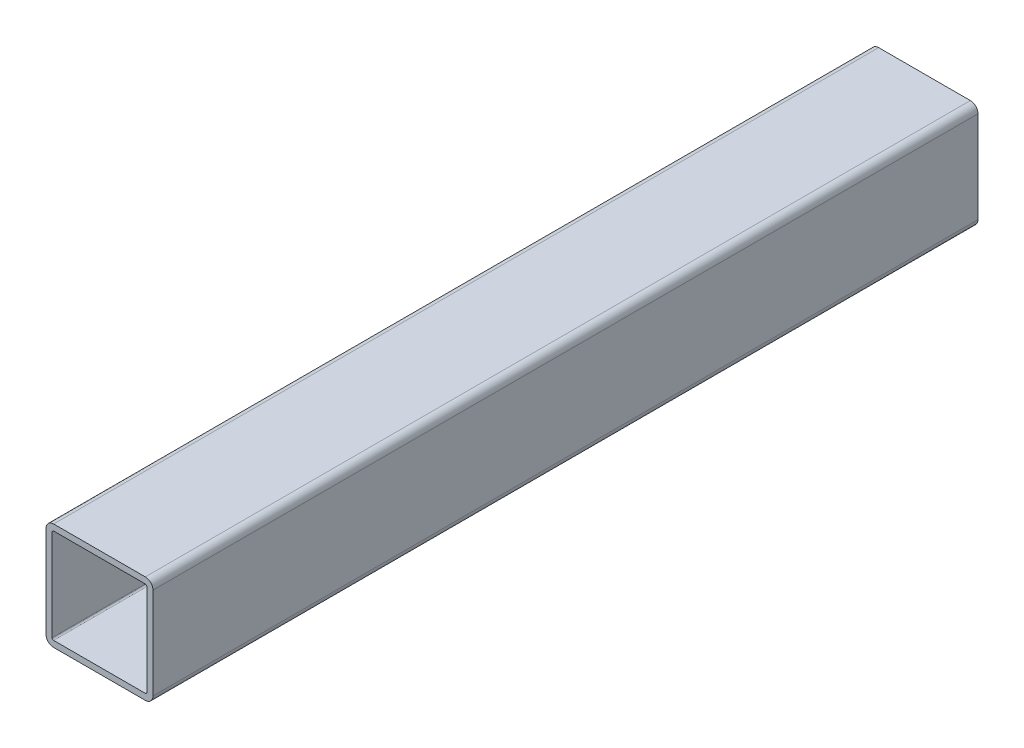
ISO-10303-21;
HEADER;
FILE_DESCRIPTION(('STEP AP214'),'2;1');
FILE_NAME('part.step','',(''),(''),'','','');
FILE_SCHEMA(('AUTOMOTIVE_DESIGN { 1 0 10303 214 1 1 1 1 }'));
ENDSEC;
DATA;
#1=APPLICATION_CONTEXT('core data for automotive mechanical design processes');
#2=APPLICATION_PROTOCOL_DEFINITION('international standard','automotive_design',2000,#1);
#3=PRODUCT_CONTEXT('',#1,'mechanical');
#4=PRODUCT('Part','Part','',(#3));
#5=PRODUCT_RELATED_PRODUCT_CATEGORY('part','',(#4));
#6=PRODUCT_DEFINITION_FORMATION('','',#4);
#7=PRODUCT_DEFINITION_CONTEXT('part definition',#1,'design');
#8=PRODUCT_DEFINITION('design','',#6,#7);
#9=PRODUCT_DEFINITION_SHAPE('','',#8);
#10=(LENGTH_UNIT() NAMED_UNIT(*) SI_UNIT(.MILLI.,.METRE.));
#11=(NAMED_UNIT(*) PLANE_ANGLE_UNIT() SI_UNIT($,.RADIAN.));
#12=(NAMED_UNIT(*) SI_UNIT($,.STERADIAN.) SOLID_ANGLE_UNIT());
#13=UNCERTAINTY_MEASURE_WITH_UNIT(LENGTH_MEASURE(1.E-05),#10,'distance_accuracy_value','');
#14=(GEOMETRIC_REPRESENTATION_CONTEXT(3) GLOBAL_UNCERTAINTY_ASSIGNED_CONTEXT((#13)) GLOBAL_UNIT_ASSIGNED_CONTEXT((#10,
#11,#12)) REPRESENTATION_CONTEXT('',''));
#15=CARTESIAN_POINT('',(0.,0.,0.));
#16=DIRECTION('',(0.,0.,1.));
#17=DIRECTION('',(1.,0.,0.));
#18=AXIS2_PLACEMENT_3D('',#15,#16,#17);
#19=CARTESIAN_POINT('',(5.,5.,540.));
#20=DIRECTION('',(0.,0.,-1.));
#21=DIRECTION('',(-1.,0.,0.));
#22=AXIS2_PLACEMENT_3D('',#19,#20,#21);
#23=PLANE('',#22);
#24=CARTESIAN_POINT('',(5.,5.,540.));
#25=DIRECTION('',(0.,0.,1.));
#26=DIRECTION('',(-1.,0.,0.));
#27=AXIS2_PLACEMENT_3D('',#24,#25,#26);
#28=CIRCLE('',#27,5.);
#29=CARTESIAN_POINT('',(0.,5.00000000000004,540.));
#30=VERTEX_POINT('',#29);
#31=CARTESIAN_POINT('',(5.00000000000004,0.,540.));
#32=VERTEX_POINT('',#31);
#33=EDGE_CURVE('E211',#30,#32,#28,.T.);
#34=ORIENTED_EDGE('',*,*,#33,.T.);
#35=DIRECTION('',(1.,0.,0.));
#36=VECTOR('',#35,1.);
#37=CARTESIAN_POINT('',(5.00000000000004,0.,540.));
#38=LINE('',#37,#36);
#39=CARTESIAN_POINT('',(65.,0.,540.));
#40=VERTEX_POINT('',#39);
#41=EDGE_CURVE('E214',#32,#40,#38,.T.);
#42=ORIENTED_EDGE('',*,*,#41,.T.);
#43=CARTESIAN_POINT('',(65.,5.,540.));
#44=DIRECTION('',(0.,0.,1.));
#45=DIRECTION('',(1.,0.,0.));
#46=AXIS2_PLACEMENT_3D('',#43,#44,#45);
#47=CIRCLE('',#46,5.);
#48=CARTESIAN_POINT('',(70.,5.00000000000003,540.));
#49=VERTEX_POINT('',#48);
#50=EDGE_CURVE('E217',#40,#49,#47,.T.);
#51=ORIENTED_EDGE('',*,*,#50,.T.);
#52=DIRECTION('',(0.,1.,0.));
#53=VECTOR('',#52,1.);
#54=CARTESIAN_POINT('',(70.,5.00000000000004,540.));
#55=LINE('',#54,#53);
#56=CARTESIAN_POINT('',(70.,65.,540.));
#57=VERTEX_POINT('',#56);
#58=EDGE_CURVE('E219',#49,#57,#55,.T.);
#59=ORIENTED_EDGE('',*,*,#58,.T.);
#60=CARTESIAN_POINT('',(65.,65.,540.));
#61=DIRECTION('',(0.,0.,1.));
#62=DIRECTION('',(-1.,0.,0.));
#63=AXIS2_PLACEMENT_3D('',#60,#61,#62);
#64=CIRCLE('',#63,5.);
#65=CARTESIAN_POINT('',(65.,70.,540.));
#66=VERTEX_POINT('',#65);
#67=EDGE_CURVE('E221',#57,#66,#64,.T.);
#68=ORIENTED_EDGE('',*,*,#67,.T.);
#69=DIRECTION('',(-1.,0.,0.));
#70=VECTOR('',#69,1.);
#71=CARTESIAN_POINT('',(5.00000000000004,70.,540.));
#72=LINE('',#71,#70);
#73=CARTESIAN_POINT('',(5.00000000000004,70.,540.));
#74=VERTEX_POINT('',#73);
#75=EDGE_CURVE('E223',#66,#74,#72,.T.);
#76=ORIENTED_EDGE('',*,*,#75,.T.);
#77=CARTESIAN_POINT('',(5.,65.,540.));
#78=DIRECTION('',(0.,0.,1.));
#79=DIRECTION('',(-1.,0.,0.));
#80=AXIS2_PLACEMENT_3D('',#77,#78,#79);
#81=CIRCLE('',#80,5.);
#82=CARTESIAN_POINT('',(0.,65.,540.));
#83=VERTEX_POINT('',#82);
#84=EDGE_CURVE('E225',#74,#83,#81,.T.);
#85=ORIENTED_EDGE('',*,*,#84,.T.);
#86=DIRECTION('',(0.,-1.,0.));
#87=VECTOR('',#86,1.);
#88=CARTESIAN_POINT('',(0.,5.00000000000004,540.));
#89=LINE('',#88,#87);
#90=EDGE_CURVE('E227',#83,#30,#89,.T.);
#91=ORIENTED_EDGE('',*,*,#90,.T.);
#92=EDGE_LOOP('',(#34,#42,#51,#59,#68,#76,#85,#91));
#93=FACE_BOUND('',#92,.T.);
#94=CARTESIAN_POINT('',(5.,5.,540.));
#95=DIRECTION('',(0.,0.,1.));
#96=DIRECTION('',(-1.,0.,0.));
#97=AXIS2_PLACEMENT_3D('',#94,#95,#96);
#98=CIRCLE('',#97,0.999999999999999);
#99=CARTESIAN_POINT('',(4.,5.00000000000004,540.));
#100=VERTEX_POINT('',#99);
#101=CARTESIAN_POINT('',(5.00000000000004,4.,540.));
#102=VERTEX_POINT('',#101);
#103=EDGE_CURVE('E146',#100,#102,#98,.T.);
#104=ORIENTED_EDGE('',*,*,#103,.F.);
#105=DIRECTION('',(0.,-1.,0.));
#106=VECTOR('',#105,1.);
#107=CARTESIAN_POINT('',(4.,5.00000000000004,540.));
#108=LINE('',#107,#106);
#109=CARTESIAN_POINT('',(4.,65.,540.));
#110=VERTEX_POINT('',#109);
#111=EDGE_CURVE('E179',#110,#100,#108,.T.);
#112=ORIENTED_EDGE('',*,*,#111,.F.);
#113=CARTESIAN_POINT('',(5.,65.,540.));
#114=DIRECTION('',(0.,0.,1.));
#115=DIRECTION('',(-1.,0.,0.));
#116=AXIS2_PLACEMENT_3D('',#113,#114,#115);
#117=CIRCLE('',#116,1.);
#118=CARTESIAN_POINT('',(5.00000000000001,66.,540.));
#119=VERTEX_POINT('',#118);
#120=EDGE_CURVE('E177',#119,#110,#117,.T.);
#121=ORIENTED_EDGE('',*,*,#120,.F.);
#122=DIRECTION('',(-1.,0.,0.));
#123=VECTOR('',#122,1.);
#124=CARTESIAN_POINT('',(5.00000000000001,66.,540.));
#125=LINE('',#124,#123);
#126=CARTESIAN_POINT('',(65.,66.,540.));
#127=VERTEX_POINT('',#126);
#128=EDGE_CURVE('E175',#127,#119,#125,.T.);
#129=ORIENTED_EDGE('',*,*,#128,.F.);
#130=CARTESIAN_POINT('',(65.,65.,540.));
#131=DIRECTION('',(0.,0.,1.));
#132=DIRECTION('',(-1.,0.,0.));
#133=AXIS2_PLACEMENT_3D('',#130,#131,#132);
#134=CIRCLE('',#133,1.);
#135=CARTESIAN_POINT('',(66.,65.,540.));
#136=VERTEX_POINT('',#135);
#137=EDGE_CURVE('E173',#136,#127,#134,.T.);
#138=ORIENTED_EDGE('',*,*,#137,.F.);
#139=DIRECTION('',(0.,1.,0.));
#140=VECTOR('',#139,1.);
#141=CARTESIAN_POINT('',(66.,5.00000000000004,540.));
#142=LINE('',#141,#140);
#143=CARTESIAN_POINT('',(66.,5.00000000000004,540.));
#144=VERTEX_POINT('',#143);
#145=EDGE_CURVE('E169',#144,#136,#142,.T.);
#146=ORIENTED_EDGE('',*,*,#145,.F.);
#147=CARTESIAN_POINT('',(65.,5.,540.));
#148=DIRECTION('',(0.,0.,1.));
#149=DIRECTION('',(1.,0.,0.));
#150=AXIS2_PLACEMENT_3D('',#147,#148,#149);
#151=CIRCLE('',#150,1.);
#152=CARTESIAN_POINT('',(65.,4.,540.));
#153=VERTEX_POINT('',#152);
#154=EDGE_CURVE('E167',#153,#144,#151,.T.);
#155=ORIENTED_EDGE('',*,*,#154,.F.);
#156=DIRECTION('',(1.,0.,0.));
#157=VECTOR('',#156,1.);
#158=CARTESIAN_POINT('',(5.00000000000004,4.,540.));
#159=LINE('',#158,#157);
#160=EDGE_CURVE('E154',#102,#153,#159,.T.);
#161=ORIENTED_EDGE('',*,*,#160,.F.);
#162=EDGE_LOOP('',(#104,#112,#121,#129,#138,#146,#155,#161));
#163=FACE_BOUND('',#162,.T.);
#164=ADVANCED_FACE('F33',(#93,#163),#23,.F.);
#165=CARTESIAN_POINT('',(5.,5.,0.));
#166=DIRECTION('',(0.,0.,-1.));
#167=DIRECTION('',(-1.,0.,0.));
#168=AXIS2_PLACEMENT_3D('',#165,#166,#167);
#169=PLANE('',#168);
#170=CARTESIAN_POINT('',(5.,5.,0.));
#171=DIRECTION('',(0.,0.,1.));
#172=DIRECTION('',(-1.,0.,0.));
#173=AXIS2_PLACEMENT_3D('',#170,#171,#172);
#174=CIRCLE('',#173,5.);
#175=CARTESIAN_POINT('',(0.,5.00000000000004,0.));
#176=VERTEX_POINT('',#175);
#177=CARTESIAN_POINT('',(5.00000000000004,0.,0.));
#178=VERTEX_POINT('',#177);
#179=EDGE_CURVE('E162',#176,#178,#174,.T.);
#180=ORIENTED_EDGE('',*,*,#179,.F.);
#181=DIRECTION('',(0.,-1.,0.));
#182=VECTOR('',#181,1.);
#183=CARTESIAN_POINT('',(0.,5.00000000000004,0.));
#184=LINE('',#183,#182);
#185=CARTESIAN_POINT('',(0.,65.,0.));
#186=VERTEX_POINT('',#185);
#187=EDGE_CURVE('E215',#186,#176,#184,.T.);
#188=ORIENTED_EDGE('',*,*,#187,.F.);
#189=CARTESIAN_POINT('',(5.,65.,0.));
#190=DIRECTION('',(0.,0.,1.));
#191=DIRECTION('',(-1.,0.,0.));
#192=AXIS2_PLACEMENT_3D('',#189,#190,#191);
#193=CIRCLE('',#192,5.);
#194=CARTESIAN_POINT('',(5.00000000000004,70.,0.));
#195=VERTEX_POINT('',#194);
#196=EDGE_CURVE('E242',#195,#186,#193,.T.);
#197=ORIENTED_EDGE('',*,*,#196,.F.);
#198=DIRECTION('',(-1.,0.,0.));
#199=VECTOR('',#198,1.);
#200=CARTESIAN_POINT('',(5.00000000000004,70.,0.));
#201=LINE('',#200,#199);
#202=CARTESIAN_POINT('',(65.,70.,0.));
#203=VERTEX_POINT('',#202);
#204=EDGE_CURVE('E240',#203,#195,#201,.T.);
#205=ORIENTED_EDGE('',*,*,#204,.F.);
#206=CARTESIAN_POINT('',(65.,65.,0.));
#207=DIRECTION('',(0.,0.,1.));
#208=DIRECTION('',(-1.,0.,0.));
#209=AXIS2_PLACEMENT_3D('',#206,#207,#208);
#210=CIRCLE('',#209,5.);
#211=CARTESIAN_POINT('',(70.,65.,0.));
#212=VERTEX_POINT('',#211);
#213=EDGE_CURVE('E238',#212,#203,#210,.T.);
#214=ORIENTED_EDGE('',*,*,#213,.F.);
#215=DIRECTION('',(0.,1.,0.));
#216=VECTOR('',#215,1.);
#217=CARTESIAN_POINT('',(70.,5.00000000000004,0.));
#218=LINE('',#217,#216);
#219=CARTESIAN_POINT('',(70.,5.00000000000003,0.));
#220=VERTEX_POINT('',#219);
#221=EDGE_CURVE('E236',#220,#212,#218,.T.);
#222=ORIENTED_EDGE('',*,*,#221,.F.);
#223=CARTESIAN_POINT('',(65.,5.,0.));
#224=DIRECTION('',(0.,0.,1.));
#225=DIRECTION('',(1.,0.,0.));
#226=AXIS2_PLACEMENT_3D('',#223,#224,#225);
#227=CIRCLE('',#226,5.);
#228=CARTESIAN_POINT('',(65.,0.,0.));
#229=VERTEX_POINT('',#228);
#230=EDGE_CURVE('E234',#229,#220,#227,.T.);
#231=ORIENTED_EDGE('',*,*,#230,.F.);
#232=DIRECTION('',(1.,0.,0.));
#233=VECTOR('',#232,1.);
#234=CARTESIAN_POINT('',(5.00000000000004,0.,0.));
#235=LINE('',#234,#233);
#236=EDGE_CURVE('E232',#178,#229,#235,.T.);
#237=ORIENTED_EDGE('',*,*,#236,.F.);
#238=EDGE_LOOP('',(#180,#188,#197,#205,#214,#222,#231,#237));
#239=FACE_BOUND('',#238,.T.);
#240=DIRECTION('',(0.,-1.,0.));
#241=VECTOR('',#240,1.);
#242=CARTESIAN_POINT('',(4.,5.00000000000004,0.));
#243=LINE('',#242,#241);
#244=CARTESIAN_POINT('',(4.,65.,0.));
#245=VERTEX_POINT('',#244);
#246=CARTESIAN_POINT('',(4.,5.00000000000004,0.));
#247=VERTEX_POINT('',#246);
#248=EDGE_CURVE('E155',#245,#247,#243,.T.);
#249=ORIENTED_EDGE('',*,*,#248,.T.);
#250=CARTESIAN_POINT('',(5.,5.,0.));
#251=DIRECTION('',(0.,0.,1.));
#252=DIRECTION('',(-1.,0.,0.));
#253=AXIS2_PLACEMENT_3D('',#250,#251,#252);
#254=CIRCLE('',#253,0.999999999999999);
#255=CARTESIAN_POINT('',(5.00000000000004,4.,0.));
#256=VERTEX_POINT('',#255);
#257=EDGE_CURVE('E56',#247,#256,#254,.T.);
#258=ORIENTED_EDGE('',*,*,#257,.T.);
#259=DIRECTION('',(1.,0.,0.));
#260=VECTOR('',#259,1.);
#261=CARTESIAN_POINT('',(5.00000000000004,4.,0.));
#262=LINE('',#261,#260);
#263=CARTESIAN_POINT('',(65.,4.,0.));
#264=VERTEX_POINT('',#263);
#265=EDGE_CURVE('E161',#256,#264,#262,.T.);
#266=ORIENTED_EDGE('',*,*,#265,.T.);
#267=CARTESIAN_POINT('',(65.,5.,0.));
#268=DIRECTION('',(0.,0.,1.));
#269=DIRECTION('',(1.,0.,0.));
#270=AXIS2_PLACEMENT_3D('',#267,#268,#269);
#271=CIRCLE('',#270,1.);
#272=CARTESIAN_POINT('',(66.,5.00000000000004,0.));
#273=VERTEX_POINT('',#272);
#274=EDGE_CURVE('E183',#264,#273,#271,.T.);
#275=ORIENTED_EDGE('',*,*,#274,.T.);
#276=DIRECTION('',(0.,1.,0.));
#277=VECTOR('',#276,1.);
#278=CARTESIAN_POINT('',(66.,5.00000000000004,0.));
#279=LINE('',#278,#277);
#280=CARTESIAN_POINT('',(66.,65.,0.));
#281=VERTEX_POINT('',#280);
#282=EDGE_CURVE('E186',#273,#281,#279,.T.);
#283=ORIENTED_EDGE('',*,*,#282,.T.);
#284=CARTESIAN_POINT('',(65.,65.,0.));
#285=DIRECTION('',(0.,0.,1.));
#286=DIRECTION('',(-1.,0.,0.));
#287=AXIS2_PLACEMENT_3D('',#284,#285,#286);
#288=CIRCLE('',#287,1.);
#289=CARTESIAN_POINT('',(65.,66.,0.));
#290=VERTEX_POINT('',#289);
#291=EDGE_CURVE('E189',#281,#290,#288,.T.);
#292=ORIENTED_EDGE('',*,*,#291,.T.);
#293=DIRECTION('',(-1.,0.,0.));
#294=VECTOR('',#293,1.);
#295=CARTESIAN_POINT('',(5.00000000000001,66.,0.));
#296=LINE('',#295,#294);
#297=CARTESIAN_POINT('',(5.00000000000001,66.,0.));
#298=VERTEX_POINT('',#297);
#299=EDGE_CURVE('E192',#290,#298,#296,.T.);
#300=ORIENTED_EDGE('',*,*,#299,.T.);
#301=CARTESIAN_POINT('',(5.,65.,0.));
#302=DIRECTION('',(0.,0.,1.));
#303=DIRECTION('',(-1.,0.,0.));
#304=AXIS2_PLACEMENT_3D('',#301,#302,#303);
#305=CIRCLE('',#304,1.);
#306=EDGE_CURVE('E195',#298,#245,#305,.T.);
#307=ORIENTED_EDGE('',*,*,#306,.T.);
#308=EDGE_LOOP('',(#249,#258,#266,#275,#283,#292,#300,#307));
#309=FACE_BOUND('',#308,.T.);
#310=ADVANCED_FACE('F272',(#239,#309),#169,.T.);
#311=CARTESIAN_POINT('',(5.,5.,540.));
#312=DIRECTION('',(0.,0.,-1.));
#313=DIRECTION('',(-1.,0.,0.));
#314=AXIS2_PLACEMENT_3D('',#311,#312,#313);
#315=CYLINDRICAL_SURFACE('',#314,5.);
#316=ORIENTED_EDGE('',*,*,#179,.T.);
#317=DIRECTION('',(0.,0.,-1.));
#318=VECTOR('',#317,1.);
#319=CARTESIAN_POINT('',(5.00000000000004,0.,540.));
#320=LINE('',#319,#318);
#321=EDGE_CURVE('E11',#32,#178,#320,.T.);
#322=ORIENTED_EDGE('',*,*,#321,.F.);
#323=ORIENTED_EDGE('',*,*,#33,.F.);
#324=DIRECTION('',(0.,0.,-1.));
#325=VECTOR('',#324,1.);
#326=CARTESIAN_POINT('',(0.,5.00000000000004,540.));
#327=LINE('',#326,#325);
#328=EDGE_CURVE('E229',#30,#176,#327,.T.);
#329=ORIENTED_EDGE('',*,*,#328,.T.);
#330=EDGE_LOOP('',(#316,#322,#323,#329));
#331=FACE_BOUND('',#330,.T.);
#332=ADVANCED_FACE('F35',(#331),#315,.T.);
#333=CARTESIAN_POINT('',(5.00000000000004,0.,540.));
#334=DIRECTION('',(0.,1.,0.));
#335=DIRECTION('',(0.,0.,1.));
#336=AXIS2_PLACEMENT_3D('',#333,#334,#335);
#337=PLANE('',#336);
#338=ORIENTED_EDGE('',*,*,#236,.T.);
#339=DIRECTION('',(0.,0.,-1.));
#340=VECTOR('',#339,1.);
#341=CARTESIAN_POINT('',(65.,0.,540.));
#342=LINE('',#341,#340);
#343=EDGE_CURVE('E41',#40,#229,#342,.T.);
#344=ORIENTED_EDGE('',*,*,#343,.F.);
#345=ORIENTED_EDGE('',*,*,#41,.F.);
#346=ORIENTED_EDGE('',*,*,#321,.T.);
#347=EDGE_LOOP('',(#338,#344,#345,#346));
#348=FACE_BOUND('',#347,.T.);
#349=ADVANCED_FACE('F289',(#348),#337,.F.);
#350=CARTESIAN_POINT('',(65.,5.,540.));
#351=DIRECTION('',(0.,0.,-1.));
#352=DIRECTION('',(-1.,0.,0.));
#353=AXIS2_PLACEMENT_3D('',#350,#351,#352);
#354=CYLINDRICAL_SURFACE('',#353,5.);
#355=ORIENTED_EDGE('',*,*,#230,.T.);
#356=DIRECTION('',(0.,0.,-1.));
#357=VECTOR('',#356,1.);
#358=CARTESIAN_POINT('',(70.,5.00000000000003,540.));
#359=LINE('',#358,#357);
#360=EDGE_CURVE('E259',#49,#220,#359,.T.);
#361=ORIENTED_EDGE('',*,*,#360,.F.);
#362=ORIENTED_EDGE('',*,*,#50,.F.);
#363=ORIENTED_EDGE('',*,*,#343,.T.);
#364=EDGE_LOOP('',(#355,#361,#362,#363));
#365=FACE_BOUND('',#364,.T.);
#366=ADVANCED_FACE('F266',(#365),#354,.T.);
#367=CARTESIAN_POINT('',(70.,5.00000000000004,540.));
#368=DIRECTION('',(-1.,0.,0.));
#369=DIRECTION('',(0.,0.,1.));
#370=AXIS2_PLACEMENT_3D('',#367,#368,#369);
#371=PLANE('',#370);
#372=ORIENTED_EDGE('',*,*,#221,.T.);
#373=DIRECTION('',(0.,0.,-1.));
#374=VECTOR('',#373,1.);
#375=CARTESIAN_POINT('',(70.,65.,540.));
#376=LINE('',#375,#374);
#377=EDGE_CURVE('E256',#57,#212,#376,.T.);
#378=ORIENTED_EDGE('',*,*,#377,.F.);
#379=ORIENTED_EDGE('',*,*,#58,.F.);
#380=ORIENTED_EDGE('',*,*,#360,.T.);
#381=EDGE_LOOP('',(#372,#378,#379,#380));
#382=FACE_BOUND('',#381,.T.);
#383=ADVANCED_FACE('F278',(#382),#371,.F.);
#384=CARTESIAN_POINT('',(65.,65.,540.));
#385=DIRECTION('',(0.,0.,-1.));
#386=DIRECTION('',(-1.,0.,0.));
#387=AXIS2_PLACEMENT_3D('',#384,#385,#386);
#388=CYLINDRICAL_SURFACE('',#387,5.);
#389=ORIENTED_EDGE('',*,*,#213,.T.);
#390=DIRECTION('',(0.,0.,-1.));
#391=VECTOR('',#390,1.);
#392=CARTESIAN_POINT('',(65.,70.,540.));
#393=LINE('',#392,#391);
#394=EDGE_CURVE('E253',#66,#203,#393,.T.);
#395=ORIENTED_EDGE('',*,*,#394,.F.);
#396=ORIENTED_EDGE('',*,*,#67,.F.);
#397=ORIENTED_EDGE('',*,*,#377,.T.);
#398=EDGE_LOOP('',(#389,#395,#396,#397));
#399=FACE_BOUND('',#398,.T.);
#400=ADVANCED_FACE('F282',(#399),#388,.T.);
#401=CARTESIAN_POINT('',(5.00000000000004,70.,540.));
#402=DIRECTION('',(0.,-1.,0.));
#403=DIRECTION('',(0.,0.,-1.));
#404=AXIS2_PLACEMENT_3D('',#401,#402,#403);
#405=PLANE('',#404);
#406=ORIENTED_EDGE('',*,*,#204,.T.);
#407=DIRECTION('',(0.,0.,-1.));
#408=VECTOR('',#407,1.);
#409=CARTESIAN_POINT('',(5.00000000000004,70.,540.));
#410=LINE('',#409,#408);
#411=EDGE_CURVE('E250',#74,#195,#410,.T.);
#412=ORIENTED_EDGE('',*,*,#411,.F.);
#413=ORIENTED_EDGE('',*,*,#75,.F.);
#414=ORIENTED_EDGE('',*,*,#394,.T.);
#415=EDGE_LOOP('',(#406,#412,#413,#414));
#416=FACE_BOUND('',#415,.T.);
#417=ADVANCED_FACE('F302',(#416),#405,.F.);
#418=CARTESIAN_POINT('',(5.,65.,540.));
#419=DIRECTION('',(0.,0.,-1.));
#420=DIRECTION('',(-1.,0.,0.));
#421=AXIS2_PLACEMENT_3D('',#418,#419,#420);
#422=CYLINDRICAL_SURFACE('',#421,5.);
#423=ORIENTED_EDGE('',*,*,#196,.T.);
#424=DIRECTION('',(0.,0.,-1.));
#425=VECTOR('',#424,1.);
#426=CARTESIAN_POINT('',(0.,65.,540.));
#427=LINE('',#426,#425);
#428=EDGE_CURVE('E247',#83,#186,#427,.T.);
#429=ORIENTED_EDGE('',*,*,#428,.F.);
#430=ORIENTED_EDGE('',*,*,#84,.F.);
#431=ORIENTED_EDGE('',*,*,#411,.T.);
#432=EDGE_LOOP('',(#423,#429,#430,#431));
#433=FACE_BOUND('',#432,.T.);
#434=ADVANCED_FACE('F300',(#433),#422,.T.);
#435=CARTESIAN_POINT('',(0.,5.00000000000004,540.));
#436=DIRECTION('',(1.,0.,0.));
#437=DIRECTION('',(0.,0.,-1.));
#438=AXIS2_PLACEMENT_3D('',#435,#436,#437);
#439=PLANE('',#438);
#440=ORIENTED_EDGE('',*,*,#187,.T.);
#441=ORIENTED_EDGE('',*,*,#328,.F.);
#442=ORIENTED_EDGE('',*,*,#90,.F.);
#443=ORIENTED_EDGE('',*,*,#428,.T.);
#444=EDGE_LOOP('',(#440,#441,#442,#443));
#445=FACE_BOUND('',#444,.T.);
#446=ADVANCED_FACE('F295',(#445),#439,.F.);
#447=CARTESIAN_POINT('',(5.,5.,540.));
#448=DIRECTION('',(0.,0.,-1.));
#449=DIRECTION('',(-1.,0.,0.));
#450=AXIS2_PLACEMENT_3D('',#447,#448,#449);
#451=CYLINDRICAL_SURFACE('',#450,0.999999999999999);
#452=ORIENTED_EDGE('',*,*,#257,.F.);
#453=DIRECTION('',(0.,0.,-1.));
#454=VECTOR('',#453,1.);
#455=CARTESIAN_POINT('',(4.,5.00000000000004,540.));
#456=LINE('',#455,#454);
#457=EDGE_CURVE('E150',#100,#247,#456,.T.);
#458=ORIENTED_EDGE('',*,*,#457,.F.);
#459=ORIENTED_EDGE('',*,*,#103,.T.);
#460=DIRECTION('',(0.,0.,-1.));
#461=VECTOR('',#460,1.);
#462=CARTESIAN_POINT('',(5.00000000000004,4.,540.));
#463=LINE('',#462,#461);
#464=EDGE_CURVE('E149',#102,#256,#463,.T.);
#465=ORIENTED_EDGE('',*,*,#464,.T.);
#466=EDGE_LOOP('',(#452,#458,#459,#465));
#467=FACE_BOUND('',#466,.T.);
#468=ADVANCED_FACE('F148',(#467),#451,.F.);
#469=CARTESIAN_POINT('',(5.00000000000004,4.,540.));
#470=DIRECTION('',(0.,1.,0.));
#471=DIRECTION('',(-1.,0.,0.));
#472=AXIS2_PLACEMENT_3D('',#469,#470,#471);
#473=PLANE('',#472);
#474=ORIENTED_EDGE('',*,*,#265,.F.);
#475=ORIENTED_EDGE('',*,*,#464,.F.);
#476=ORIENTED_EDGE('',*,*,#160,.T.);
#477=DIRECTION('',(0.,0.,-1.));
#478=VECTOR('',#477,1.);
#479=CARTESIAN_POINT('',(65.,4.,540.));
#480=LINE('',#479,#478);
#481=EDGE_CURVE('E163',#153,#264,#480,.T.);
#482=ORIENTED_EDGE('',*,*,#481,.T.);
#483=EDGE_LOOP('',(#474,#475,#476,#482));
#484=FACE_BOUND('',#483,.T.);
#485=ADVANCED_FACE('F158',(#484),#473,.T.);
#486=CARTESIAN_POINT('',(65.,5.,540.));
#487=DIRECTION('',(0.,0.,-1.));
#488=DIRECTION('',(-1.,0.,0.));
#489=AXIS2_PLACEMENT_3D('',#486,#487,#488);
#490=CYLINDRICAL_SURFACE('',#489,1.);
#491=ORIENTED_EDGE('',*,*,#274,.F.);
#492=ORIENTED_EDGE('',*,*,#481,.F.);
#493=ORIENTED_EDGE('',*,*,#154,.T.);
#494=DIRECTION('',(0.,0.,-1.));
#495=VECTOR('',#494,1.);
#496=CARTESIAN_POINT('',(66.,5.00000000000004,540.));
#497=LINE('',#496,#495);
#498=EDGE_CURVE('E208',#144,#273,#497,.T.);
#499=ORIENTED_EDGE('',*,*,#498,.T.);
#500=EDGE_LOOP('',(#491,#492,#493,#499));
#501=FACE_BOUND('',#500,.T.);
#502=ADVANCED_FACE('F327',(#501),#490,.F.);
#503=CARTESIAN_POINT('',(66.,5.00000000000004,540.));
#504=DIRECTION('',(-1.,0.,0.));
#505=DIRECTION('',(0.,0.,1.));
#506=AXIS2_PLACEMENT_3D('',#503,#504,#505);
#507=PLANE('',#506);
#508=ORIENTED_EDGE('',*,*,#282,.F.);
#509=ORIENTED_EDGE('',*,*,#498,.F.);
#510=ORIENTED_EDGE('',*,*,#145,.T.);
#511=DIRECTION('',(0.,0.,-1.));
#512=VECTOR('',#511,1.);
#513=CARTESIAN_POINT('',(66.,65.,540.));
#514=LINE('',#513,#512);
#515=EDGE_CURVE('E206',#136,#281,#514,.T.);
#516=ORIENTED_EDGE('',*,*,#515,.T.);
#517=EDGE_LOOP('',(#508,#509,#510,#516));
#518=FACE_BOUND('',#517,.T.);
#519=ADVANCED_FACE('F331',(#518),#507,.T.);
#520=CARTESIAN_POINT('',(65.,65.,540.));
#521=DIRECTION('',(0.,0.,-1.));
#522=DIRECTION('',(-1.,0.,0.));
#523=AXIS2_PLACEMENT_3D('',#520,#521,#522);
#524=CYLINDRICAL_SURFACE('',#523,1.);
#525=ORIENTED_EDGE('',*,*,#291,.F.);
#526=ORIENTED_EDGE('',*,*,#515,.F.);
#527=ORIENTED_EDGE('',*,*,#137,.T.);
#528=DIRECTION('',(0.,0.,-1.));
#529=VECTOR('',#528,1.);
#530=CARTESIAN_POINT('',(65.,66.,540.));
#531=LINE('',#530,#529);
#532=EDGE_CURVE('E204',#127,#290,#531,.T.);
#533=ORIENTED_EDGE('',*,*,#532,.T.);
#534=EDGE_LOOP('',(#525,#526,#527,#533));
#535=FACE_BOUND('',#534,.T.);
#536=ADVANCED_FACE('F337',(#535),#524,.F.);
#537=CARTESIAN_POINT('',(5.00000000000001,66.,540.));
#538=DIRECTION('',(0.,-1.,0.));
#539=DIRECTION('',(0.,0.,-1.));
#540=AXIS2_PLACEMENT_3D('',#537,#538,#539);
#541=PLANE('',#540);
#542=ORIENTED_EDGE('',*,*,#299,.F.);
#543=ORIENTED_EDGE('',*,*,#532,.F.);
#544=ORIENTED_EDGE('',*,*,#128,.T.);
#545=DIRECTION('',(0.,0.,-1.));
#546=VECTOR('',#545,1.);
#547=CARTESIAN_POINT('',(5.00000000000001,66.,540.));
#548=LINE('',#547,#546);
#549=EDGE_CURVE('E202',#119,#298,#548,.T.);
#550=ORIENTED_EDGE('',*,*,#549,.T.);
#551=EDGE_LOOP('',(#542,#543,#544,#550));
#552=FACE_BOUND('',#551,.T.);
#553=ADVANCED_FACE('F341',(#552),#541,.T.);
#554=CARTESIAN_POINT('',(5.,65.,540.));
#555=DIRECTION('',(0.,0.,-1.));
#556=DIRECTION('',(-1.,0.,0.));
#557=AXIS2_PLACEMENT_3D('',#554,#555,#556);
#558=CYLINDRICAL_SURFACE('',#557,1.);
#559=ORIENTED_EDGE('',*,*,#306,.F.);
#560=ORIENTED_EDGE('',*,*,#549,.F.);
#561=ORIENTED_EDGE('',*,*,#120,.T.);
#562=DIRECTION('',(0.,0.,-1.));
#563=VECTOR('',#562,1.);
#564=CARTESIAN_POINT('',(4.,65.,540.));
#565=LINE('',#564,#563);
#566=EDGE_CURVE('E48',#110,#245,#565,.T.);
#567=ORIENTED_EDGE('',*,*,#566,.T.);
#568=EDGE_LOOP('',(#559,#560,#561,#567));
#569=FACE_BOUND('',#568,.T.);
#570=ADVANCED_FACE('F345',(#569),#558,.F.);
#571=CARTESIAN_POINT('',(4.,5.00000000000004,540.));
#572=DIRECTION('',(1.,0.,0.));
#573=DIRECTION('',(0.,0.,-1.));
#574=AXIS2_PLACEMENT_3D('',#571,#572,#573);
#575=PLANE('',#574);
#576=ORIENTED_EDGE('',*,*,#248,.F.);
#577=ORIENTED_EDGE('',*,*,#566,.F.);
#578=ORIENTED_EDGE('',*,*,#111,.T.);
#579=ORIENTED_EDGE('',*,*,#457,.T.);
#580=EDGE_LOOP('',(#576,#577,#578,#579));
#581=FACE_BOUND('',#580,.T.);
#582=ADVANCED_FACE('F349',(#581),#575,.T.);
#583=CLOSED_SHELL('',(#164,#310,#332,#349,#366,#383,#400,#417,#434,#446,#468,#485,#502,#519,
#536,#553,#570,#582));
#584=MANIFOLD_SOLID_BREP('B2',#583);
#585=ADVANCED_BREP_SHAPE_REPRESENTATION('',(#18,#584),#14);
#586=SHAPE_DEFINITION_REPRESENTATION(#9,#585);
ENDSEC;
END-ISO-10303-21;
